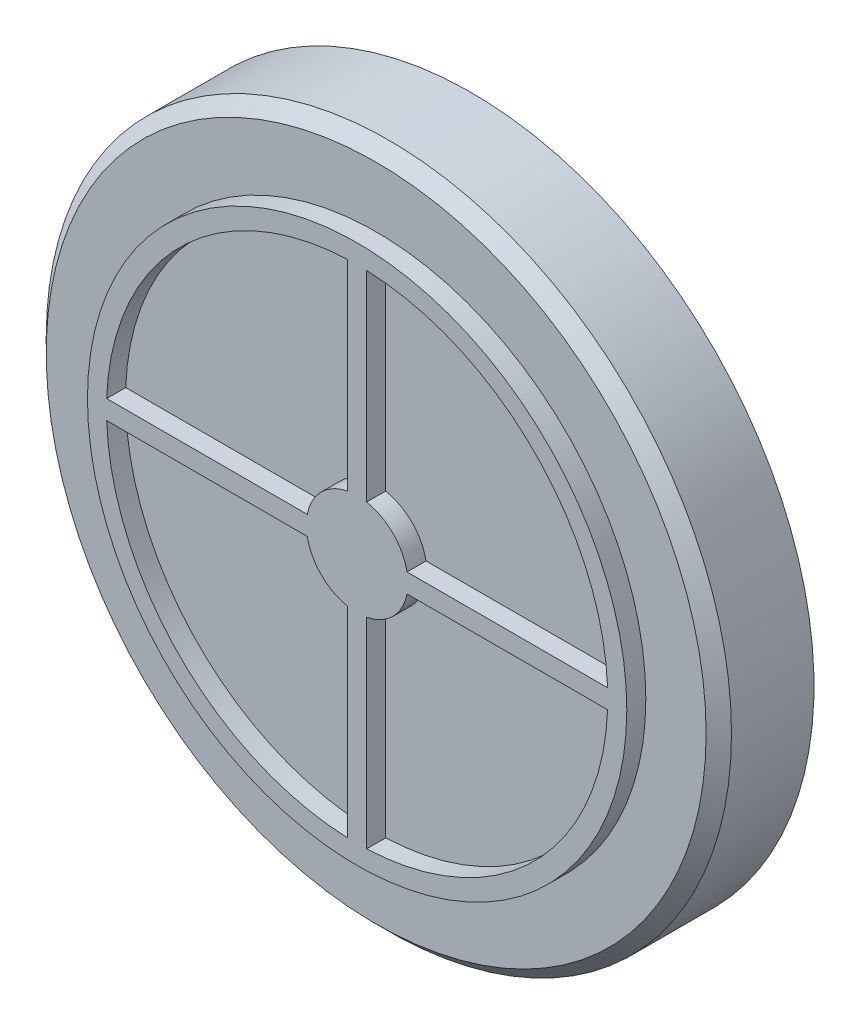
ISO-10303-21;
HEADER;
FILE_DESCRIPTION(('STEP AP214'),'2;1');
FILE_NAME('part.step','',(''),(''),'','','');
FILE_SCHEMA(('AUTOMOTIVE_DESIGN { 1 0 10303 214 1 1 1 1 }'));
ENDSEC;
DATA;
#1=APPLICATION_CONTEXT('core data for automotive mechanical design processes');
#2=APPLICATION_PROTOCOL_DEFINITION('international standard','automotive_design',2000,#1);
#3=PRODUCT_CONTEXT('',#1,'mechanical');
#4=PRODUCT('Part','Part','',(#3));
#5=PRODUCT_RELATED_PRODUCT_CATEGORY('part','',(#4));
#6=PRODUCT_DEFINITION_FORMATION('','',#4);
#7=PRODUCT_DEFINITION_CONTEXT('part definition',#1,'design');
#8=PRODUCT_DEFINITION('design','',#6,#7);
#9=PRODUCT_DEFINITION_SHAPE('','',#8);
#10=(LENGTH_UNIT() NAMED_UNIT(*) SI_UNIT(.MILLI.,.METRE.));
#11=(NAMED_UNIT(*) PLANE_ANGLE_UNIT() SI_UNIT($,.RADIAN.));
#12=(NAMED_UNIT(*) SI_UNIT($,.STERADIAN.) SOLID_ANGLE_UNIT());
#13=UNCERTAINTY_MEASURE_WITH_UNIT(LENGTH_MEASURE(1.E-05),#10,'distance_accuracy_value','');
#14=(GEOMETRIC_REPRESENTATION_CONTEXT(3) GLOBAL_UNCERTAINTY_ASSIGNED_CONTEXT((#13)) GLOBAL_UNIT_ASSIGNED_CONTEXT((#10,
#11,#12)) REPRESENTATION_CONTEXT('',''));
#15=CARTESIAN_POINT('',(0.,0.,0.));
#16=DIRECTION('',(0.,0.,1.));
#17=DIRECTION('',(1.,0.,0.));
#18=AXIS2_PLACEMENT_3D('',#15,#16,#17);
#19=CARTESIAN_POINT('',(0.,0.,-2.99999999999999));
#20=DIRECTION('',(0.,0.,-1.));
#21=DIRECTION('',(-1.,0.,0.));
#22=AXIS2_PLACEMENT_3D('',#19,#20,#21);
#23=CYLINDRICAL_SURFACE('',#22,54.);
#24=CARTESIAN_POINT('',(0.,0.,-2.00000000000002));
#25=DIRECTION('',(0.,0.,1.));
#26=DIRECTION('',(1.,0.,0.));
#27=AXIS2_PLACEMENT_3D('',#24,#25,#26);
#28=CIRCLE('',#27,54.);
#29=CARTESIAN_POINT('',(54.,0.,-2.00000000000002));
#30=VERTEX_POINT('',#29);
#31=EDGE_CURVE('E328',#30,#30,#28,.F.);
#32=ORIENTED_EDGE('',*,*,#31,.T.);
#33=EDGE_LOOP('',(#32));
#34=FACE_BOUND('',#33,.T.);
#35=CARTESIAN_POINT('',(0.,0.,-15.));
#36=DIRECTION('',(0.,0.,-1.));
#37=DIRECTION('',(-1.,0.,0.));
#38=AXIS2_PLACEMENT_3D('',#35,#36,#37);
#39=CIRCLE('',#38,54.);
#40=CARTESIAN_POINT('',(-54.,0.,-15.));
#41=VERTEX_POINT('',#40);
#42=EDGE_CURVE('E265',#41,#41,#39,.F.);
#43=ORIENTED_EDGE('',*,*,#42,.T.);
#44=EDGE_LOOP('',(#43));
#45=FACE_BOUND('',#44,.T.);
#46=ADVANCED_FACE('F99',(#34,#45),#23,.T.);
#47=CARTESIAN_POINT('',(0.,0.,-111.722871427475));
#48=DIRECTION('',(0.,0.,1.));
#49=DIRECTION('',(1.,0.,0.));
#50=AXIS2_PLACEMENT_3D('',#47,#48,#49);
#51=CYLINDRICAL_SURFACE('',#50,39.5);
#52=DIRECTION('',(0.,0.,1.));
#53=VECTOR('',#52,1.);
#54=CARTESIAN_POINT('',(1.5,-39.4715087119811,-111.722871427475));
#55=LINE('',#54,#53);
#56=CARTESIAN_POINT('',(1.5,-39.4715087119811,3.));
#57=VERTEX_POINT('',#56);
#58=CARTESIAN_POINT('',(1.5,-39.4715087119811,0.));
#59=VERTEX_POINT('',#58);
#60=EDGE_CURVE('E309',#57,#59,#55,.F.);
#61=ORIENTED_EDGE('',*,*,#60,.F.);
#62=CARTESIAN_POINT('',(0.,0.,3.));
#63=DIRECTION('',(0.,0.,1.));
#64=DIRECTION('',(1.,0.,0.));
#65=AXIS2_PLACEMENT_3D('',#62,#63,#64);
#66=CIRCLE('',#65,39.5);
#67=CARTESIAN_POINT('',(39.4715087119811,-1.5,3.));
#68=VERTEX_POINT('',#67);
#69=EDGE_CURVE('E315',#57,#68,#66,.T.);
#70=ORIENTED_EDGE('',*,*,#69,.T.);
#71=DIRECTION('',(0.,0.,-1.));
#72=VECTOR('',#71,1.);
#73=CARTESIAN_POINT('',(39.4715087119811,-1.5,3.));
#74=LINE('',#73,#72);
#75=CARTESIAN_POINT('',(39.4715087119811,-1.5,0.));
#76=VERTEX_POINT('',#75);
#77=EDGE_CURVE('E291',#68,#76,#74,.T.);
#78=ORIENTED_EDGE('',*,*,#77,.T.);
#79=CARTESIAN_POINT('',(0.,0.,0.));
#80=DIRECTION('',(0.,0.,1.));
#81=DIRECTION('',(1.,0.,0.));
#82=AXIS2_PLACEMENT_3D('',#79,#80,#81);
#83=CIRCLE('',#82,39.5);
#84=EDGE_CURVE('E321',#76,#59,#83,.F.);
#85=ORIENTED_EDGE('',*,*,#84,.T.);
#86=EDGE_LOOP('',(#61,#70,#78,#85));
#87=FACE_BOUND('',#86,.T.);
#88=ADVANCED_FACE('F353',(#87),#51,.F.);
#89=DIRECTION('',(0.,0.,1.));
#90=VECTOR('',#89,1.);
#91=CARTESIAN_POINT('',(1.5,39.4715087119811,-111.722871427475));
#92=LINE('',#91,#90);
#93=CARTESIAN_POINT('',(1.5,39.4715087119811,0.));
#94=VERTEX_POINT('',#93);
#95=CARTESIAN_POINT('',(1.5,39.4715087119811,3.));
#96=VERTEX_POINT('',#95);
#97=EDGE_CURVE('E232',#94,#96,#92,.T.);
#98=ORIENTED_EDGE('',*,*,#97,.F.);
#99=CARTESIAN_POINT('',(39.4715087119811,1.5,0.));
#100=VERTEX_POINT('',#99);
#101=EDGE_CURVE('E319',#94,#100,#83,.F.);
#102=ORIENTED_EDGE('',*,*,#101,.T.);
#103=DIRECTION('',(0.,0.,-1.));
#104=VECTOR('',#103,1.);
#105=CARTESIAN_POINT('',(39.4715087119811,1.5,3.));
#106=LINE('',#105,#104);
#107=CARTESIAN_POINT('',(39.4715087119811,1.5,3.));
#108=VERTEX_POINT('',#107);
#109=EDGE_CURVE('E289',#108,#100,#106,.T.);
#110=ORIENTED_EDGE('',*,*,#109,.F.);
#111=EDGE_CURVE('E316',#108,#96,#66,.T.);
#112=ORIENTED_EDGE('',*,*,#111,.T.);
#113=EDGE_LOOP('',(#98,#102,#110,#112));
#114=FACE_BOUND('',#113,.T.);
#115=ADVANCED_FACE('F388',(#114),#51,.F.);
#116=CARTESIAN_POINT('',(-39.4715087119811,-1.5,3.));
#117=VERTEX_POINT('',#116);
#118=CARTESIAN_POINT('',(-1.5,-39.4715087119811,3.));
#119=VERTEX_POINT('',#118);
#120=EDGE_CURVE('E367',#117,#119,#66,.T.);
#121=ORIENTED_EDGE('',*,*,#120,.T.);
#122=DIRECTION('',(0.,0.,1.));
#123=VECTOR('',#122,1.);
#124=CARTESIAN_POINT('',(-1.5,-39.4715087119811,-111.722871427475));
#125=LINE('',#124,#123);
#126=CARTESIAN_POINT('',(-1.5,-39.4715087119811,0.));
#127=VERTEX_POINT('',#126);
#128=EDGE_CURVE('E122',#119,#127,#125,.F.);
#129=ORIENTED_EDGE('',*,*,#128,.T.);
#130=CARTESIAN_POINT('',(-39.4715087119811,-1.5,0.));
#131=VERTEX_POINT('',#130);
#132=EDGE_CURVE('E325',#127,#131,#83,.F.);
#133=ORIENTED_EDGE('',*,*,#132,.T.);
#134=DIRECTION('',(0.,0.,-1.));
#135=VECTOR('',#134,1.);
#136=CARTESIAN_POINT('',(-39.4715087119811,-1.5,3.));
#137=LINE('',#136,#135);
#138=EDGE_CURVE('E305',#117,#131,#137,.T.);
#139=ORIENTED_EDGE('',*,*,#138,.F.);
#140=EDGE_LOOP('',(#121,#129,#133,#139));
#141=FACE_BOUND('',#140,.T.);
#142=ADVANCED_FACE('F624',(#141),#51,.F.);
#143=CARTESIAN_POINT('',(-39.4715087119811,1.5,0.));
#144=VERTEX_POINT('',#143);
#145=CARTESIAN_POINT('',(-1.5,39.4715087119811,0.));
#146=VERTEX_POINT('',#145);
#147=EDGE_CURVE('E376',#144,#146,#83,.F.);
#148=ORIENTED_EDGE('',*,*,#147,.T.);
#149=DIRECTION('',(0.,0.,1.));
#150=VECTOR('',#149,1.);
#151=CARTESIAN_POINT('',(-1.5,39.4715087119811,-111.722871427475));
#152=LINE('',#151,#150);
#153=CARTESIAN_POINT('',(-1.5,39.4715087119811,3.));
#154=VERTEX_POINT('',#153);
#155=EDGE_CURVE('E311',#146,#154,#152,.T.);
#156=ORIENTED_EDGE('',*,*,#155,.T.);
#157=CARTESIAN_POINT('',(-39.4715087119811,1.5,3.));
#158=VERTEX_POINT('',#157);
#159=EDGE_CURVE('E320',#154,#158,#66,.T.);
#160=ORIENTED_EDGE('',*,*,#159,.T.);
#161=DIRECTION('',(0.,0.,-1.));
#162=VECTOR('',#161,1.);
#163=CARTESIAN_POINT('',(-39.4715087119811,1.5,3.));
#164=LINE('',#163,#162);
#165=EDGE_CURVE('E233',#158,#144,#164,.T.);
#166=ORIENTED_EDGE('',*,*,#165,.T.);
#167=EDGE_LOOP('',(#148,#156,#160,#166));
#168=FACE_BOUND('',#167,.T.);
#169=ADVANCED_FACE('F374',(#168),#51,.F.);
#170=CARTESIAN_POINT('',(0.,0.,0.));
#171=DIRECTION('',(0.,0.,1.));
#172=DIRECTION('',(1.,0.,0.));
#173=AXIS2_PLACEMENT_3D('',#170,#171,#172);
#174=PLANE('',#173);
#175=DIRECTION('',(0.,-1.,0.));
#176=VECTOR('',#175,1.);
#177=CARTESIAN_POINT('',(-1.5,0.,0.));
#178=LINE('',#177,#176);
#179=CARTESIAN_POINT('',(-1.5,-7.85811682275086,0.));
#180=VERTEX_POINT('',#179);
#181=EDGE_CURVE('E12',#180,#127,#178,.T.);
#182=ORIENTED_EDGE('',*,*,#181,.F.);
#183=CARTESIAN_POINT('',(0.,0.,0.));
#184=DIRECTION('',(0.,0.,1.));
#185=DIRECTION('',(1.,0.,0.));
#186=AXIS2_PLACEMENT_3D('',#183,#184,#185);
#187=CIRCLE('',#186,8.);
#188=CARTESIAN_POINT('',(-7.85811682275086,-1.5,0.));
#189=VERTEX_POINT('',#188);
#190=EDGE_CURVE('E269',#189,#180,#187,.T.);
#191=ORIENTED_EDGE('',*,*,#190,.F.);
#192=DIRECTION('',(1.,0.,0.));
#193=VECTOR('',#192,1.);
#194=CARTESIAN_POINT('',(0.,-1.5,0.));
#195=LINE('',#194,#193);
#196=EDGE_CURVE('E267',#131,#189,#195,.T.);
#197=ORIENTED_EDGE('',*,*,#196,.F.);
#198=ORIENTED_EDGE('',*,*,#132,.F.);
#199=EDGE_LOOP('',(#182,#191,#197,#198));
#200=FACE_BOUND('',#199,.T.);
#201=ADVANCED_FACE('F481',(#200),#174,.T.);
#202=DIRECTION('',(0.,1.,0.));
#203=VECTOR('',#202,1.);
#204=CARTESIAN_POINT('',(-1.5,0.,0.));
#205=LINE('',#204,#203);
#206=CARTESIAN_POINT('',(-1.5,7.85811682275086,0.));
#207=VERTEX_POINT('',#206);
#208=EDGE_CURVE('E223',#207,#146,#205,.T.);
#209=ORIENTED_EDGE('',*,*,#208,.T.);
#210=ORIENTED_EDGE('',*,*,#147,.F.);
#211=DIRECTION('',(1.,0.,0.));
#212=VECTOR('',#211,1.);
#213=CARTESIAN_POINT('',(0.,1.5,0.));
#214=LINE('',#213,#212);
#215=CARTESIAN_POINT('',(-7.85811682275086,1.5,0.));
#216=VERTEX_POINT('',#215);
#217=EDGE_CURVE('E264',#144,#216,#214,.T.);
#218=ORIENTED_EDGE('',*,*,#217,.T.);
#219=CARTESIAN_POINT('',(0.,0.,0.));
#220=DIRECTION('',(0.,0.,1.));
#221=DIRECTION('',(1.,0.,0.));
#222=AXIS2_PLACEMENT_3D('',#219,#220,#221);
#223=CIRCLE('',#222,8.);
#224=EDGE_CURVE('E229',#207,#216,#223,.T.);
#225=ORIENTED_EDGE('',*,*,#224,.F.);
#226=EDGE_LOOP('',(#209,#210,#218,#225));
#227=FACE_BOUND('',#226,.T.);
#228=ADVANCED_FACE('F381',(#227),#174,.T.);
#229=CARTESIAN_POINT('',(0.,0.,0.));
#230=DIRECTION('',(0.,0.,1.));
#231=DIRECTION('',(1.,0.,0.));
#232=AXIS2_PLACEMENT_3D('',#229,#230,#231);
#233=CIRCLE('',#232,8.);
#234=CARTESIAN_POINT('',(1.5,-7.85811682275086,0.));
#235=VERTEX_POINT('',#234);
#236=CARTESIAN_POINT('',(7.85811682275086,-1.5,0.));
#237=VERTEX_POINT('',#236);
#238=EDGE_CURVE('E272',#235,#237,#233,.T.);
#239=ORIENTED_EDGE('',*,*,#238,.F.);
#240=DIRECTION('',(0.,-1.,0.));
#241=VECTOR('',#240,1.);
#242=CARTESIAN_POINT('',(1.5,0.,0.));
#243=LINE('',#242,#241);
#244=EDGE_CURVE('E108',#235,#59,#243,.T.);
#245=ORIENTED_EDGE('',*,*,#244,.T.);
#246=ORIENTED_EDGE('',*,*,#84,.F.);
#247=DIRECTION('',(1.,0.,0.));
#248=VECTOR('',#247,1.);
#249=CARTESIAN_POINT('',(0.,-1.5,0.));
#250=LINE('',#249,#248);
#251=EDGE_CURVE('E274',#237,#76,#250,.T.);
#252=ORIENTED_EDGE('',*,*,#251,.F.);
#253=EDGE_LOOP('',(#239,#245,#246,#252));
#254=FACE_BOUND('',#253,.T.);
#255=ADVANCED_FACE('F347',(#254),#174,.T.);
#256=CARTESIAN_POINT('',(0.,0.,0.));
#257=DIRECTION('',(0.,0.,1.));
#258=DIRECTION('',(1.,0.,0.));
#259=AXIS2_PLACEMENT_3D('',#256,#257,#258);
#260=PLANE('',#259);
#261=CARTESIAN_POINT('',(0.,0.,0.));
#262=DIRECTION('',(0.,0.,1.));
#263=DIRECTION('',(1.,0.,0.));
#264=AXIS2_PLACEMENT_3D('',#261,#262,#263);
#265=CIRCLE('',#264,42.5);
#266=CARTESIAN_POINT('',(42.5,0.,0.));
#267=VERTEX_POINT('',#266);
#268=EDGE_CURVE('E329',#267,#267,#265,.T.);
#269=ORIENTED_EDGE('',*,*,#268,.F.);
#270=EDGE_LOOP('',(#269));
#271=FACE_BOUND('',#270,.T.);
#272=CARTESIAN_POINT('',(0.,0.,0.));
#273=DIRECTION('',(0.,0.,1.));
#274=DIRECTION('',(1.,0.,0.));
#275=AXIS2_PLACEMENT_3D('',#272,#273,#274);
#276=CIRCLE('',#275,52.);
#277=CARTESIAN_POINT('',(52.,0.,0.));
#278=VERTEX_POINT('',#277);
#279=EDGE_CURVE('E335',#278,#278,#276,.T.);
#280=ORIENTED_EDGE('',*,*,#279,.T.);
#281=EDGE_LOOP('',(#280));
#282=FACE_BOUND('',#281,.T.);
#283=ADVANCED_FACE('F428',(#271,#282),#260,.T.);
#284=CARTESIAN_POINT('',(0.,0.,-2.00000000000002));
#285=DIRECTION('',(0.,0.,-1.));
#286=DIRECTION('',(-1.,0.,0.));
#287=AXIS2_PLACEMENT_3D('',#284,#285,#286);
#288=CONICAL_SURFACE('',#287,54.,0.785398163397453);
#289=ORIENTED_EDGE('',*,*,#279,.F.);
#290=EDGE_LOOP('',(#289));
#291=FACE_BOUND('',#290,.T.);
#292=ORIENTED_EDGE('',*,*,#31,.F.);
#293=EDGE_LOOP('',(#292));
#294=FACE_BOUND('',#293,.T.);
#295=ADVANCED_FACE('F430',(#291,#294),#288,.T.);
#296=CARTESIAN_POINT('',(0.,0.,3.));
#297=DIRECTION('',(0.,0.,-1.));
#298=DIRECTION('',(-1.,0.,0.));
#299=AXIS2_PLACEMENT_3D('',#296,#297,#298);
#300=CYLINDRICAL_SURFACE('',#299,42.5);
#301=CARTESIAN_POINT('',(0.,0.,3.));
#302=DIRECTION('',(0.,0.,1.));
#303=DIRECTION('',(1.,0.,0.));
#304=AXIS2_PLACEMENT_3D('',#301,#302,#303);
#305=CIRCLE('',#304,42.5);
#306=CARTESIAN_POINT('',(42.5,0.,3.));
#307=VERTEX_POINT('',#306);
#308=EDGE_CURVE('E324',#307,#307,#305,.T.);
#309=ORIENTED_EDGE('',*,*,#308,.F.);
#310=EDGE_LOOP('',(#309));
#311=FACE_BOUND('',#310,.T.);
#312=ORIENTED_EDGE('',*,*,#268,.T.);
#313=EDGE_LOOP('',(#312));
#314=FACE_BOUND('',#313,.T.);
#315=ADVANCED_FACE('F436',(#311,#314),#300,.T.);
#316=CARTESIAN_POINT('',(0.,0.,3.));
#317=DIRECTION('',(0.,0.,1.));
#318=DIRECTION('',(1.,0.,0.));
#319=AXIS2_PLACEMENT_3D('',#316,#317,#318);
#320=PLANE('',#319);
#321=ORIENTED_EDGE('',*,*,#159,.F.);
#322=DIRECTION('',(0.,1.,0.));
#323=VECTOR('',#322,1.);
#324=CARTESIAN_POINT('',(-1.5,0.,3.));
#325=LINE('',#324,#323);
#326=CARTESIAN_POINT('',(-1.5,7.85811682275086,3.));
#327=VERTEX_POINT('',#326);
#328=EDGE_CURVE('E221',#327,#154,#325,.T.);
#329=ORIENTED_EDGE('',*,*,#328,.F.);
#330=CARTESIAN_POINT('',(0.,0.,3.));
#331=DIRECTION('',(0.,0.,1.));
#332=DIRECTION('',(1.,0.,0.));
#333=AXIS2_PLACEMENT_3D('',#330,#331,#332);
#334=CIRCLE('',#333,8.);
#335=CARTESIAN_POINT('',(-7.85811682275086,1.5,3.));
#336=VERTEX_POINT('',#335);
#337=EDGE_CURVE('E213',#327,#336,#334,.T.);
#338=ORIENTED_EDGE('',*,*,#337,.T.);
#339=DIRECTION('',(1.,0.,0.));
#340=VECTOR('',#339,1.);
#341=CARTESIAN_POINT('',(0.,1.5,3.));
#342=LINE('',#341,#340);
#343=EDGE_CURVE('E219',#158,#336,#342,.T.);
#344=ORIENTED_EDGE('',*,*,#343,.F.);
#345=EDGE_LOOP('',(#321,#329,#338,#344));
#346=FACE_BOUND('',#345,.T.);
#347=DIRECTION('',(0.,1.,0.));
#348=VECTOR('',#347,1.);
#349=CARTESIAN_POINT('',(1.5,0.,3.));
#350=LINE('',#349,#348);
#351=CARTESIAN_POINT('',(1.5,7.85811682275086,3.));
#352=VERTEX_POINT('',#351);
#353=EDGE_CURVE('E258',#352,#96,#350,.T.);
#354=ORIENTED_EDGE('',*,*,#353,.T.);
#355=ORIENTED_EDGE('',*,*,#111,.F.);
#356=DIRECTION('',(1.,0.,0.));
#357=VECTOR('',#356,1.);
#358=CARTESIAN_POINT('',(0.,1.5,3.));
#359=LINE('',#358,#357);
#360=CARTESIAN_POINT('',(7.85811682275086,1.5,3.));
#361=VERTEX_POINT('',#360);
#362=EDGE_CURVE('E253',#361,#108,#359,.T.);
#363=ORIENTED_EDGE('',*,*,#362,.F.);
#364=CARTESIAN_POINT('',(0.,0.,3.));
#365=DIRECTION('',(0.,0.,1.));
#366=DIRECTION('',(1.,0.,0.));
#367=AXIS2_PLACEMENT_3D('',#364,#365,#366);
#368=CIRCLE('',#367,8.);
#369=EDGE_CURVE('E255',#361,#352,#368,.T.);
#370=ORIENTED_EDGE('',*,*,#369,.T.);
#371=EDGE_LOOP('',(#354,#355,#363,#370));
#372=FACE_BOUND('',#371,.T.);
#373=DIRECTION('',(0.,1.,0.));
#374=VECTOR('',#373,1.);
#375=CARTESIAN_POINT('',(-1.5,0.,3.));
#376=LINE('',#375,#374);
#377=CARTESIAN_POINT('',(-1.5,-7.85811682275086,3.));
#378=VERTEX_POINT('',#377);
#379=EDGE_CURVE('E245',#119,#378,#376,.T.);
#380=ORIENTED_EDGE('',*,*,#379,.F.);
#381=ORIENTED_EDGE('',*,*,#120,.F.);
#382=DIRECTION('',(1.,0.,0.));
#383=VECTOR('',#382,1.);
#384=CARTESIAN_POINT('',(0.,-1.5,3.));
#385=LINE('',#384,#383);
#386=CARTESIAN_POINT('',(-7.85811682275086,-1.5,3.));
#387=VERTEX_POINT('',#386);
#388=EDGE_CURVE('E237',#117,#387,#385,.T.);
#389=ORIENTED_EDGE('',*,*,#388,.T.);
#390=CARTESIAN_POINT('',(0.,0.,3.));
#391=DIRECTION('',(0.,0.,1.));
#392=DIRECTION('',(1.,0.,0.));
#393=AXIS2_PLACEMENT_3D('',#390,#391,#392);
#394=CIRCLE('',#393,8.);
#395=EDGE_CURVE('E239',#387,#378,#394,.T.);
#396=ORIENTED_EDGE('',*,*,#395,.T.);
#397=EDGE_LOOP('',(#380,#381,#389,#396));
#398=FACE_BOUND('',#397,.T.);
#399=ORIENTED_EDGE('',*,*,#69,.F.);
#400=DIRECTION('',(0.,1.,0.));
#401=VECTOR('',#400,1.);
#402=CARTESIAN_POINT('',(1.5,0.,3.));
#403=LINE('',#402,#401);
#404=CARTESIAN_POINT('',(1.5,-7.85811682275086,3.));
#405=VERTEX_POINT('',#404);
#406=EDGE_CURVE('E247',#57,#405,#403,.T.);
#407=ORIENTED_EDGE('',*,*,#406,.T.);
#408=CARTESIAN_POINT('',(0.,0.,3.));
#409=DIRECTION('',(0.,0.,1.));
#410=DIRECTION('',(1.,0.,0.));
#411=AXIS2_PLACEMENT_3D('',#408,#409,#410);
#412=CIRCLE('',#411,8.);
#413=CARTESIAN_POINT('',(7.85811682275086,-1.5,3.));
#414=VERTEX_POINT('',#413);
#415=EDGE_CURVE('E249',#405,#414,#412,.T.);
#416=ORIENTED_EDGE('',*,*,#415,.T.);
#417=DIRECTION('',(1.,0.,0.));
#418=VECTOR('',#417,1.);
#419=CARTESIAN_POINT('',(0.,-1.5,3.));
#420=LINE('',#419,#418);
#421=EDGE_CURVE('E251',#414,#68,#420,.T.);
#422=ORIENTED_EDGE('',*,*,#421,.T.);
#423=EDGE_LOOP('',(#399,#407,#416,#422));
#424=FACE_BOUND('',#423,.T.);
#425=ORIENTED_EDGE('',*,*,#308,.T.);
#426=EDGE_LOOP('',(#425));
#427=FACE_BOUND('',#426,.T.);
#428=ADVANCED_FACE('F216',(#346,#372,#398,#424,#427),#320,.T.);
#429=ORIENTED_EDGE('',*,*,#101,.F.);
#430=DIRECTION('',(0.,1.,0.));
#431=VECTOR('',#430,1.);
#432=CARTESIAN_POINT('',(1.5,0.,0.));
#433=LINE('',#432,#431);
#434=CARTESIAN_POINT('',(1.5,7.85811682275086,0.));
#435=VERTEX_POINT('',#434);
#436=EDGE_CURVE('E280',#435,#94,#433,.T.);
#437=ORIENTED_EDGE('',*,*,#436,.F.);
#438=CARTESIAN_POINT('',(0.,0.,0.));
#439=DIRECTION('',(0.,0.,1.));
#440=DIRECTION('',(1.,0.,0.));
#441=AXIS2_PLACEMENT_3D('',#438,#439,#440);
#442=CIRCLE('',#441,8.);
#443=CARTESIAN_POINT('',(7.85811682275086,1.5,0.));
#444=VERTEX_POINT('',#443);
#445=EDGE_CURVE('E277',#444,#435,#442,.T.);
#446=ORIENTED_EDGE('',*,*,#445,.F.);
#447=DIRECTION('',(1.,0.,0.));
#448=VECTOR('',#447,1.);
#449=CARTESIAN_POINT('',(0.,1.5,0.));
#450=LINE('',#449,#448);
#451=EDGE_CURVE('E115',#444,#100,#450,.T.);
#452=ORIENTED_EDGE('',*,*,#451,.T.);
#453=EDGE_LOOP('',(#429,#437,#446,#452));
#454=FACE_BOUND('',#453,.T.);
#455=ADVANCED_FACE('F392',(#454),#174,.T.);
#456=CARTESIAN_POINT('',(-1.5,0.,3.));
#457=DIRECTION('',(-1.,0.,0.));
#458=DIRECTION('',(0.,0.,1.));
#459=AXIS2_PLACEMENT_3D('',#456,#457,#458);
#460=PLANE('',#459);
#461=ORIENTED_EDGE('',*,*,#128,.F.);
#462=ORIENTED_EDGE('',*,*,#379,.T.);
#463=DIRECTION('',(0.,0.,-1.));
#464=VECTOR('',#463,1.);
#465=CARTESIAN_POINT('',(-1.5,-7.85811682275086,3.));
#466=LINE('',#465,#464);
#467=EDGE_CURVE('E300',#378,#180,#466,.T.);
#468=ORIENTED_EDGE('',*,*,#467,.T.);
#469=ORIENTED_EDGE('',*,*,#181,.T.);
#470=EDGE_LOOP('',(#461,#462,#468,#469));
#471=FACE_BOUND('',#470,.T.);
#472=ADVANCED_FACE('F472',(#471),#460,.T.);
#473=CARTESIAN_POINT('',(-1.5,0.,3.));
#474=DIRECTION('',(-1.,0.,0.));
#475=DIRECTION('',(0.,0.,1.));
#476=AXIS2_PLACEMENT_3D('',#473,#474,#475);
#477=PLANE('',#476);
#478=ORIENTED_EDGE('',*,*,#155,.F.);
#479=ORIENTED_EDGE('',*,*,#208,.F.);
#480=DIRECTION('',(0.,0.,-1.));
#481=VECTOR('',#480,1.);
#482=CARTESIAN_POINT('',(-1.5,7.85811682275086,3.));
#483=LINE('',#482,#481);
#484=EDGE_CURVE('E262',#327,#207,#483,.T.);
#485=ORIENTED_EDGE('',*,*,#484,.F.);
#486=ORIENTED_EDGE('',*,*,#328,.T.);
#487=EDGE_LOOP('',(#478,#479,#485,#486));
#488=FACE_BOUND('',#487,.T.);
#489=ADVANCED_FACE('F379',(#488),#477,.T.);
#490=CARTESIAN_POINT('',(1.5,0.,3.));
#491=DIRECTION('',(-1.,0.,0.));
#492=DIRECTION('',(0.,0.,1.));
#493=AXIS2_PLACEMENT_3D('',#490,#491,#492);
#494=PLANE('',#493);
#495=ORIENTED_EDGE('',*,*,#406,.F.);
#496=ORIENTED_EDGE('',*,*,#60,.T.);
#497=ORIENTED_EDGE('',*,*,#244,.F.);
#498=DIRECTION('',(0.,0.,-1.));
#499=VECTOR('',#498,1.);
#500=CARTESIAN_POINT('',(1.5,-7.85811682275086,3.));
#501=LINE('',#500,#499);
#502=EDGE_CURVE('E297',#405,#235,#501,.T.);
#503=ORIENTED_EDGE('',*,*,#502,.F.);
#504=EDGE_LOOP('',(#495,#496,#497,#503));
#505=FACE_BOUND('',#504,.T.);
#506=ADVANCED_FACE('F364',(#505),#494,.F.);
#507=CARTESIAN_POINT('',(1.5,0.,3.));
#508=DIRECTION('',(-1.,0.,0.));
#509=DIRECTION('',(0.,0.,1.));
#510=AXIS2_PLACEMENT_3D('',#507,#508,#509);
#511=PLANE('',#510);
#512=ORIENTED_EDGE('',*,*,#436,.T.);
#513=ORIENTED_EDGE('',*,*,#97,.T.);
#514=ORIENTED_EDGE('',*,*,#353,.F.);
#515=DIRECTION('',(0.,0.,-1.));
#516=VECTOR('',#515,1.);
#517=CARTESIAN_POINT('',(1.5,7.85811682275086,3.));
#518=LINE('',#517,#516);
#519=EDGE_CURVE('E285',#352,#435,#518,.T.);
#520=ORIENTED_EDGE('',*,*,#519,.T.);
#521=EDGE_LOOP('',(#512,#513,#514,#520));
#522=FACE_BOUND('',#521,.T.);
#523=ADVANCED_FACE('F402',(#522),#511,.F.);
#524=CARTESIAN_POINT('',(0.,1.5,3.));
#525=DIRECTION('',(0.,1.,0.));
#526=DIRECTION('',(-1.,0.,0.));
#527=AXIS2_PLACEMENT_3D('',#524,#525,#526);
#528=PLANE('',#527);
#529=ORIENTED_EDGE('',*,*,#217,.F.);
#530=ORIENTED_EDGE('',*,*,#165,.F.);
#531=ORIENTED_EDGE('',*,*,#343,.T.);
#532=DIRECTION('',(0.,0.,-1.));
#533=VECTOR('',#532,1.);
#534=CARTESIAN_POINT('',(-7.85811682275086,1.5,3.));
#535=LINE('',#534,#533);
#536=EDGE_CURVE('E226',#336,#216,#535,.T.);
#537=ORIENTED_EDGE('',*,*,#536,.T.);
#538=EDGE_LOOP('',(#529,#530,#531,#537));
#539=FACE_BOUND('',#538,.T.);
#540=ADVANCED_FACE('F235',(#539),#528,.T.);
#541=CARTESIAN_POINT('',(0.,-1.5,3.));
#542=DIRECTION('',(0.,1.,0.));
#543=DIRECTION('',(-1.,0.,0.));
#544=AXIS2_PLACEMENT_3D('',#541,#542,#543);
#545=PLANE('',#544);
#546=ORIENTED_EDGE('',*,*,#196,.T.);
#547=DIRECTION('',(0.,0.,-1.));
#548=VECTOR('',#547,1.);
#549=CARTESIAN_POINT('',(-7.85811682275086,-1.5,3.));
#550=LINE('',#549,#548);
#551=EDGE_CURVE('E302',#387,#189,#550,.T.);
#552=ORIENTED_EDGE('',*,*,#551,.F.);
#553=ORIENTED_EDGE('',*,*,#388,.F.);
#554=ORIENTED_EDGE('',*,*,#138,.T.);
#555=EDGE_LOOP('',(#546,#552,#553,#554));
#556=FACE_BOUND('',#555,.T.);
#557=ADVANCED_FACE('F409',(#556),#545,.F.);
#558=CARTESIAN_POINT('',(0.,0.,3.));
#559=DIRECTION('',(0.,0.,-1.));
#560=DIRECTION('',(-1.,0.,0.));
#561=AXIS2_PLACEMENT_3D('',#558,#559,#560);
#562=CYLINDRICAL_SURFACE('',#561,8.);
#563=ORIENTED_EDGE('',*,*,#190,.T.);
#564=ORIENTED_EDGE('',*,*,#467,.F.);
#565=ORIENTED_EDGE('',*,*,#395,.F.);
#566=ORIENTED_EDGE('',*,*,#551,.T.);
#567=EDGE_LOOP('',(#563,#564,#565,#566));
#568=FACE_BOUND('',#567,.T.);
#569=ADVANCED_FACE('F484',(#568),#562,.T.);
#570=CARTESIAN_POINT('',(0.,0.,3.));
#571=DIRECTION('',(0.,0.,-1.));
#572=DIRECTION('',(-1.,0.,0.));
#573=AXIS2_PLACEMENT_3D('',#570,#571,#572);
#574=CYLINDRICAL_SURFACE('',#573,8.);
#575=ORIENTED_EDGE('',*,*,#224,.T.);
#576=ORIENTED_EDGE('',*,*,#536,.F.);
#577=ORIENTED_EDGE('',*,*,#337,.F.);
#578=ORIENTED_EDGE('',*,*,#484,.T.);
#579=EDGE_LOOP('',(#575,#576,#577,#578));
#580=FACE_BOUND('',#579,.T.);
#581=ADVANCED_FACE('F227',(#580),#574,.T.);
#582=CARTESIAN_POINT('',(0.,0.,3.));
#583=DIRECTION('',(0.,0.,-1.));
#584=DIRECTION('',(-1.,0.,0.));
#585=AXIS2_PLACEMENT_3D('',#582,#583,#584);
#586=CYLINDRICAL_SURFACE('',#585,8.);
#587=ORIENTED_EDGE('',*,*,#238,.T.);
#588=DIRECTION('',(0.,0.,-1.));
#589=VECTOR('',#588,1.);
#590=CARTESIAN_POINT('',(7.85811682275086,-1.5,3.));
#591=LINE('',#590,#589);
#592=EDGE_CURVE('E294',#414,#237,#591,.T.);
#593=ORIENTED_EDGE('',*,*,#592,.F.);
#594=ORIENTED_EDGE('',*,*,#415,.F.);
#595=ORIENTED_EDGE('',*,*,#502,.T.);
#596=EDGE_LOOP('',(#587,#593,#594,#595));
#597=FACE_BOUND('',#596,.T.);
#598=ADVANCED_FACE('F363',(#597),#586,.T.);
#599=CARTESIAN_POINT('',(0.,-1.5,3.));
#600=DIRECTION('',(0.,1.,0.));
#601=DIRECTION('',(-1.,0.,0.));
#602=AXIS2_PLACEMENT_3D('',#599,#600,#601);
#603=PLANE('',#602);
#604=ORIENTED_EDGE('',*,*,#251,.T.);
#605=ORIENTED_EDGE('',*,*,#77,.F.);
#606=ORIENTED_EDGE('',*,*,#421,.F.);
#607=ORIENTED_EDGE('',*,*,#592,.T.);
#608=EDGE_LOOP('',(#604,#605,#606,#607));
#609=FACE_BOUND('',#608,.T.);
#610=ADVANCED_FACE('F359',(#609),#603,.F.);
#611=CARTESIAN_POINT('',(0.,1.5,3.));
#612=DIRECTION('',(0.,1.,0.));
#613=DIRECTION('',(-1.,0.,0.));
#614=AXIS2_PLACEMENT_3D('',#611,#612,#613);
#615=PLANE('',#614);
#616=ORIENTED_EDGE('',*,*,#451,.F.);
#617=DIRECTION('',(0.,0.,-1.));
#618=VECTOR('',#617,1.);
#619=CARTESIAN_POINT('',(7.85811682275086,1.5,3.));
#620=LINE('',#619,#618);
#621=EDGE_CURVE('E287',#361,#444,#620,.T.);
#622=ORIENTED_EDGE('',*,*,#621,.F.);
#623=ORIENTED_EDGE('',*,*,#362,.T.);
#624=ORIENTED_EDGE('',*,*,#109,.T.);
#625=EDGE_LOOP('',(#616,#622,#623,#624));
#626=FACE_BOUND('',#625,.T.);
#627=ADVANCED_FACE('F398',(#626),#615,.T.);
#628=CARTESIAN_POINT('',(0.,0.,3.));
#629=DIRECTION('',(0.,0.,-1.));
#630=DIRECTION('',(-1.,0.,0.));
#631=AXIS2_PLACEMENT_3D('',#628,#629,#630);
#632=CYLINDRICAL_SURFACE('',#631,8.);
#633=ORIENTED_EDGE('',*,*,#445,.T.);
#634=ORIENTED_EDGE('',*,*,#519,.F.);
#635=ORIENTED_EDGE('',*,*,#369,.F.);
#636=ORIENTED_EDGE('',*,*,#621,.T.);
#637=EDGE_LOOP('',(#633,#634,#635,#636));
#638=FACE_BOUND('',#637,.T.);
#639=ADVANCED_FACE('F395',(#638),#632,.T.);
#640=CARTESIAN_POINT('',(0.,0.,-15.));
#641=DIRECTION('',(0.,0.,-1.));
#642=DIRECTION('',(-1.,0.,0.));
#643=AXIS2_PLACEMENT_3D('',#640,#641,#642);
#644=PLANE('',#643);
#645=ORIENTED_EDGE('',*,*,#42,.F.);
#646=EDGE_LOOP('',(#645));
#647=FACE_BOUND('',#646,.T.);
#648=CARTESIAN_POINT('',(0.,0.,-15.));
#649=DIRECTION('',(0.,0.,-1.));
#650=DIRECTION('',(-1.,0.,0.));
#651=AXIS2_PLACEMENT_3D('',#648,#649,#650);
#652=CIRCLE('',#651,51.);
#653=CARTESIAN_POINT('',(-51.,0.,-15.));
#654=VERTEX_POINT('',#653);
#655=EDGE_CURVE('E103',#654,#654,#652,.T.);
#656=ORIENTED_EDGE('',*,*,#655,.F.);
#657=EDGE_LOOP('',(#656));
#658=FACE_BOUND('',#657,.T.);
#659=ADVANCED_FACE('F456',(#647,#658),#644,.T.);
#660=CARTESIAN_POINT('',(-51.,0.,-3.));
#661=DIRECTION('',(0.,0.,-1.));
#662=DIRECTION('',(-1.,0.,0.));
#663=AXIS2_PLACEMENT_3D('',#660,#661,#662);
#664=PLANE('',#663);
#665=CARTESIAN_POINT('',(0.,0.,-2.99999999999999));
#666=DIRECTION('',(0.,0.,-1.));
#667=DIRECTION('',(-1.,0.,0.));
#668=AXIS2_PLACEMENT_3D('',#665,#666,#667);
#669=CIRCLE('',#668,46.);
#670=CARTESIAN_POINT('',(-46.,0.,-2.99999999999999));
#671=VERTEX_POINT('',#670);
#672=EDGE_CURVE('E338',#671,#671,#669,.T.);
#673=ORIENTED_EDGE('',*,*,#672,.T.);
#674=EDGE_LOOP('',(#673));
#675=FACE_BOUND('',#674,.T.);
#676=ADVANCED_FACE('F455',(#675),#664,.T.);
#677=CARTESIAN_POINT('',(0.,0.,-7.99999999999999));
#678=DIRECTION('',(0.,0.,-1.));
#679=DIRECTION('',(-1.,0.,0.));
#680=AXIS2_PLACEMENT_3D('',#677,#678,#679);
#681=TOROIDAL_SURFACE('',#680,46.,5.);
#682=CARTESIAN_POINT('',(0.,0.,-7.99999999999999));
#683=DIRECTION('',(0.,0.,-1.));
#684=DIRECTION('',(-1.,0.,0.));
#685=AXIS2_PLACEMENT_3D('',#682,#683,#684);
#686=CIRCLE('',#685,51.);
#687=CARTESIAN_POINT('',(-51.,0.,-8.));
#688=VERTEX_POINT('',#687);
#689=EDGE_CURVE('E332',#688,#688,#686,.F.);
#690=ORIENTED_EDGE('',*,*,#689,.F.);
#691=EDGE_LOOP('',(#690));
#692=FACE_BOUND('',#691,.T.);
#693=ORIENTED_EDGE('',*,*,#672,.F.);
#694=EDGE_LOOP('',(#693));
#695=FACE_BOUND('',#694,.T.);
#696=ADVANCED_FACE('F101',(#692,#695),#681,.F.);
#697=CARTESIAN_POINT('',(0.,0.,-2.99999999999999));
#698=DIRECTION('',(0.,0.,-1.));
#699=DIRECTION('',(-1.,0.,0.));
#700=AXIS2_PLACEMENT_3D('',#697,#698,#699);
#701=CYLINDRICAL_SURFACE('',#700,51.);
#702=ORIENTED_EDGE('',*,*,#689,.T.);
#703=EDGE_LOOP('',(#702));
#704=FACE_BOUND('',#703,.T.);
#705=ORIENTED_EDGE('',*,*,#655,.T.);
#706=EDGE_LOOP('',(#705));
#707=FACE_BOUND('',#706,.T.);
#708=ADVANCED_FACE('F426',(#704,#707),#701,.F.);
#709=CLOSED_SHELL('',(#46,#88,#115,#142,#169,#201,#228,#255,#283,#295,#315,#428,#455,#472,#489,
#506,#523,#540,#557,#569,#581,#598,#610,#627,#639,#659,#676,#696,#708));
#710=MANIFOLD_SOLID_BREP('B2',#709);
#711=ADVANCED_BREP_SHAPE_REPRESENTATION('',(#18,#710),#14);
#712=SHAPE_DEFINITION_REPRESENTATION(#9,#711);
ENDSEC;
END-ISO-10303-21;
